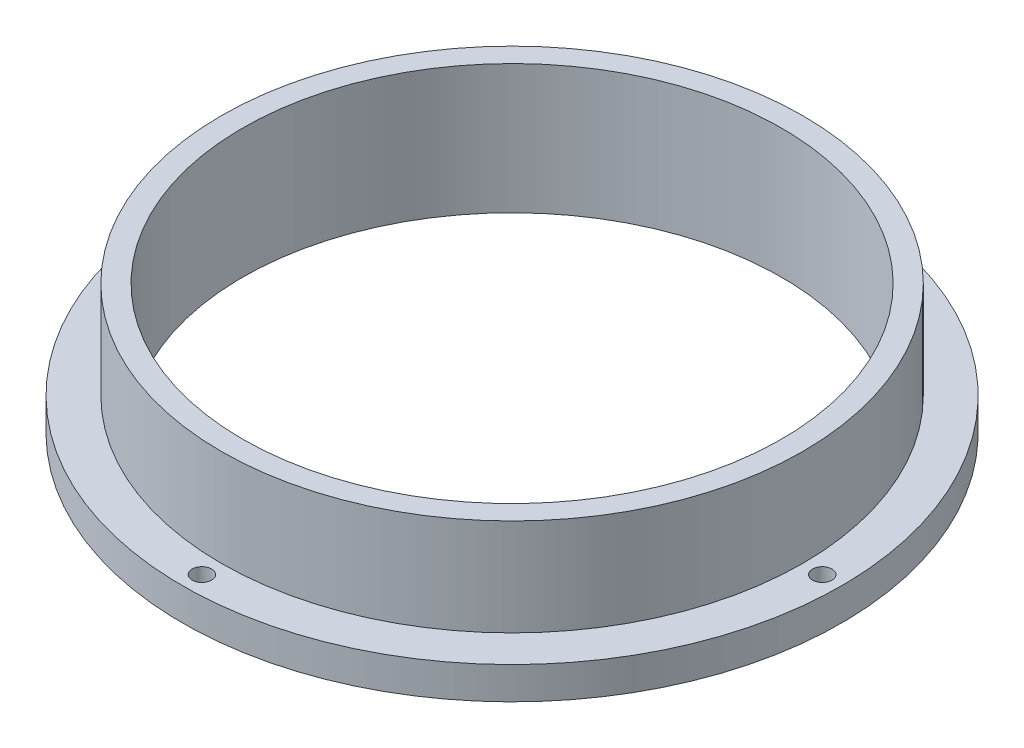
ISO-10303-21;
HEADER;
FILE_DESCRIPTION(('STEP AP214'),'2;1');
FILE_NAME('part.step','',(''),(''),'','','');
FILE_SCHEMA(('AUTOMOTIVE_DESIGN { 1 0 10303 214 1 1 1 1 }'));
ENDSEC;
DATA;
#1=APPLICATION_CONTEXT('core data for automotive mechanical design processes');
#2=APPLICATION_PROTOCOL_DEFINITION('international standard','automotive_design',2000,#1);
#3=PRODUCT_CONTEXT('',#1,'mechanical');
#4=PRODUCT('Part','Part','',(#3));
#5=PRODUCT_RELATED_PRODUCT_CATEGORY('part','',(#4));
#6=PRODUCT_DEFINITION_FORMATION('','',#4);
#7=PRODUCT_DEFINITION_CONTEXT('part definition',#1,'design');
#8=PRODUCT_DEFINITION('design','',#6,#7);
#9=PRODUCT_DEFINITION_SHAPE('','',#8);
#10=(LENGTH_UNIT() NAMED_UNIT(*) SI_UNIT(.MILLI.,.METRE.));
#11=(NAMED_UNIT(*) PLANE_ANGLE_UNIT() SI_UNIT($,.RADIAN.));
#12=(NAMED_UNIT(*) SI_UNIT($,.STERADIAN.) SOLID_ANGLE_UNIT());
#13=UNCERTAINTY_MEASURE_WITH_UNIT(LENGTH_MEASURE(1.E-05),#10,'distance_accuracy_value','');
#14=(GEOMETRIC_REPRESENTATION_CONTEXT(3) GLOBAL_UNCERTAINTY_ASSIGNED_CONTEXT((#13)) GLOBAL_UNIT_ASSIGNED_CONTEXT((#10,
#11,#12)) REPRESENTATION_CONTEXT('',''));
#15=CARTESIAN_POINT('',(0.,0.,0.));
#16=DIRECTION('',(0.,0.,1.));
#17=DIRECTION('',(1.,0.,0.));
#18=AXIS2_PLACEMENT_3D('',#15,#16,#17);
#19=CARTESIAN_POINT('',(0.,20.,0.));
#20=DIRECTION('',(0.,-1.,0.));
#21=DIRECTION('',(0.,0.,-1.));
#22=AXIS2_PLACEMENT_3D('',#19,#20,#21);
#23=CYLINDRICAL_SURFACE('',#22,45.);
#24=CARTESIAN_POINT('',(0.,20.,0.));
#25=DIRECTION('',(0.,1.,0.));
#26=DIRECTION('',(0.,0.,1.));
#27=AXIS2_PLACEMENT_3D('',#24,#25,#26);
#28=CIRCLE('',#27,45.);
#29=CARTESIAN_POINT('',(0.,20.,45.));
#30=VERTEX_POINT('',#29);
#31=EDGE_CURVE('E49',#30,#30,#28,.T.);
#32=ORIENTED_EDGE('',*,*,#31,.F.);
#33=EDGE_LOOP('',(#32));
#34=FACE_BOUND('',#33,.T.);
#35=CARTESIAN_POINT('',(0.,5.,0.));
#36=DIRECTION('',(0.,-1.,0.));
#37=DIRECTION('',(0.,0.,-1.));
#38=AXIS2_PLACEMENT_3D('',#35,#36,#37);
#39=CIRCLE('',#38,45.);
#40=CARTESIAN_POINT('',(0.,5.,-45.));
#41=VERTEX_POINT('',#40);
#42=EDGE_CURVE('E10',#41,#41,#39,.T.);
#43=ORIENTED_EDGE('',*,*,#42,.F.);
#44=EDGE_LOOP('',(#43));
#45=FACE_BOUND('',#44,.T.);
#46=ADVANCED_FACE('F42',(#34,#45),#23,.T.);
#47=CARTESIAN_POINT('',(0.,20.,0.));
#48=DIRECTION('',(0.,1.,0.));
#49=DIRECTION('',(0.,0.,1.));
#50=AXIS2_PLACEMENT_3D('',#47,#48,#49);
#51=PLANE('',#50);
#52=CARTESIAN_POINT('',(0.,20.,0.));
#53=DIRECTION('',(0.,1.,0.));
#54=DIRECTION('',(0.,0.,1.));
#55=AXIS2_PLACEMENT_3D('',#52,#53,#54);
#56=CIRCLE('',#55,41.7);
#57=CARTESIAN_POINT('',(0.,20.,41.7));
#58=VERTEX_POINT('',#57);
#59=EDGE_CURVE('E98',#58,#58,#56,.T.);
#60=ORIENTED_EDGE('',*,*,#59,.F.);
#61=EDGE_LOOP('',(#60));
#62=FACE_BOUND('',#61,.T.);
#63=ORIENTED_EDGE('',*,*,#31,.T.);
#64=EDGE_LOOP('',(#63));
#65=FACE_BOUND('',#64,.T.);
#66=ADVANCED_FACE('F116',(#62,#65),#51,.T.);
#67=CARTESIAN_POINT('',(0.,0.,0.));
#68=DIRECTION('',(0.,1.,0.));
#69=DIRECTION('',(0.,0.,1.));
#70=AXIS2_PLACEMENT_3D('',#67,#68,#69);
#71=PLANE('',#70);
#72=CARTESIAN_POINT('',(0.,0.,0.));
#73=DIRECTION('',(0.,1.,0.));
#74=DIRECTION('',(0.,0.,1.));
#75=AXIS2_PLACEMENT_3D('',#72,#73,#74);
#76=CIRCLE('',#75,41.7);
#77=CARTESIAN_POINT('',(0.,0.,41.7));
#78=VERTEX_POINT('',#77);
#79=EDGE_CURVE('E82',#78,#78,#76,.T.);
#80=ORIENTED_EDGE('',*,*,#79,.T.);
#81=EDGE_LOOP('',(#80));
#82=FACE_BOUND('',#81,.T.);
#83=CARTESIAN_POINT('',(48.,0.,0.));
#84=DIRECTION('',(0.,-1.,0.));
#85=DIRECTION('',(0.,0.,-1.));
#86=AXIS2_PLACEMENT_3D('',#83,#84,#85);
#87=CIRCLE('',#86,1.5);
#88=CARTESIAN_POINT('',(48.,0.,-1.5));
#89=VERTEX_POINT('',#88);
#90=EDGE_CURVE('E79',#89,#89,#87,.T.);
#91=ORIENTED_EDGE('',*,*,#90,.F.);
#92=EDGE_LOOP('',(#91));
#93=FACE_BOUND('',#92,.T.);
#94=CARTESIAN_POINT('',(5.02773312793411E-13,0.,48.));
#95=DIRECTION('',(0.,-1.,0.));
#96=DIRECTION('',(0.,0.,-1.));
#97=AXIS2_PLACEMENT_3D('',#94,#95,#96);
#98=CIRCLE('',#97,1.50000000000001);
#99=CARTESIAN_POINT('',(5.02773312793411E-13,0.,46.5));
#100=VERTEX_POINT('',#99);
#101=EDGE_CURVE('E75',#100,#100,#98,.T.);
#102=ORIENTED_EDGE('',*,*,#101,.F.);
#103=EDGE_LOOP('',(#102));
#104=FACE_BOUND('',#103,.T.);
#105=CARTESIAN_POINT('',(-48.,0.,3.35182208528941E-13));
#106=DIRECTION('',(0.,-1.,0.));
#107=DIRECTION('',(0.,0.,-1.));
#108=AXIS2_PLACEMENT_3D('',#105,#106,#107);
#109=CIRCLE('',#108,1.5);
#110=CARTESIAN_POINT('',(-48.,0.,-1.49999999999967));
#111=VERTEX_POINT('',#110);
#112=EDGE_CURVE('E71',#111,#111,#109,.T.);
#113=ORIENTED_EDGE('',*,*,#112,.F.);
#114=EDGE_LOOP('',(#113));
#115=FACE_BOUND('',#114,.T.);
#116=CARTESIAN_POINT('',(-1.6759110426447E-13,0.,-48.));
#117=DIRECTION('',(0.,-1.,0.));
#118=DIRECTION('',(0.,0.,-1.));
#119=AXIS2_PLACEMENT_3D('',#116,#117,#118);
#120=CIRCLE('',#119,1.5);
#121=CARTESIAN_POINT('',(-1.6759110426447E-13,0.,-49.5));
#122=VERTEX_POINT('',#121);
#123=EDGE_CURVE('E67',#122,#122,#120,.T.);
#124=ORIENTED_EDGE('',*,*,#123,.F.);
#125=EDGE_LOOP('',(#124));
#126=FACE_BOUND('',#125,.T.);
#127=CARTESIAN_POINT('',(0.,0.,0.));
#128=DIRECTION('',(0.,-1.,0.));
#129=DIRECTION('',(0.,0.,-1.));
#130=AXIS2_PLACEMENT_3D('',#127,#128,#129);
#131=CIRCLE('',#130,51.);
#132=CARTESIAN_POINT('',(0.,0.,-51.));
#133=VERTEX_POINT('',#132);
#134=EDGE_CURVE('E62',#133,#133,#131,.T.);
#135=ORIENTED_EDGE('',*,*,#134,.T.);
#136=EDGE_LOOP('',(#135));
#137=FACE_BOUND('',#136,.T.);
#138=ADVANCED_FACE('F106',(#82,#93,#104,#115,#126,#137),#71,.F.);
#139=CARTESIAN_POINT('',(-1.6759110426447E-13,5.,-48.));
#140=DIRECTION('',(0.,-1.,0.));
#141=DIRECTION('',(0.,0.,-1.));
#142=AXIS2_PLACEMENT_3D('',#139,#140,#141);
#143=CYLINDRICAL_SURFACE('',#142,1.5);
#144=CARTESIAN_POINT('',(-1.6759110426447E-13,5.,-48.));
#145=DIRECTION('',(0.,-1.,0.));
#146=DIRECTION('',(0.,0.,-1.));
#147=AXIS2_PLACEMENT_3D('',#144,#145,#146);
#148=CIRCLE('',#147,1.5);
#149=CARTESIAN_POINT('',(-1.6759110426447E-13,5.,-49.5));
#150=VERTEX_POINT('',#149);
#151=EDGE_CURVE('E59',#150,#150,#148,.T.);
#152=ORIENTED_EDGE('',*,*,#151,.F.);
#153=EDGE_LOOP('',(#152));
#154=FACE_BOUND('',#153,.T.);
#155=ORIENTED_EDGE('',*,*,#123,.T.);
#156=EDGE_LOOP('',(#155));
#157=FACE_BOUND('',#156,.T.);
#158=ADVANCED_FACE('F123',(#154,#157),#143,.F.);
#159=CARTESIAN_POINT('',(-48.,5.,3.35182208528941E-13));
#160=DIRECTION('',(0.,-1.,0.));
#161=DIRECTION('',(0.,0.,-1.));
#162=AXIS2_PLACEMENT_3D('',#159,#160,#161);
#163=CYLINDRICAL_SURFACE('',#162,1.5);
#164=CARTESIAN_POINT('',(-48.,5.,3.35182208528941E-13));
#165=DIRECTION('',(0.,-1.,0.));
#166=DIRECTION('',(0.,0.,-1.));
#167=AXIS2_PLACEMENT_3D('',#164,#165,#166);
#168=CIRCLE('',#167,1.5);
#169=CARTESIAN_POINT('',(-48.,5.,-1.49999999999967));
#170=VERTEX_POINT('',#169);
#171=EDGE_CURVE('E87',#170,#170,#168,.T.);
#172=ORIENTED_EDGE('',*,*,#171,.F.);
#173=EDGE_LOOP('',(#172));
#174=FACE_BOUND('',#173,.T.);
#175=ORIENTED_EDGE('',*,*,#112,.T.);
#176=EDGE_LOOP('',(#175));
#177=FACE_BOUND('',#176,.T.);
#178=ADVANCED_FACE('F135',(#174,#177),#163,.F.);
#179=CARTESIAN_POINT('',(5.02773312793411E-13,5.,48.));
#180=DIRECTION('',(0.,-1.,0.));
#181=DIRECTION('',(0.,0.,-1.));
#182=AXIS2_PLACEMENT_3D('',#179,#180,#181);
#183=CYLINDRICAL_SURFACE('',#182,1.50000000000001);
#184=CARTESIAN_POINT('',(5.02773312793411E-13,5.,48.));
#185=DIRECTION('',(0.,-1.,0.));
#186=DIRECTION('',(0.,0.,-1.));
#187=AXIS2_PLACEMENT_3D('',#184,#185,#186);
#188=CIRCLE('',#187,1.50000000000001);
#189=CARTESIAN_POINT('',(5.02773312793411E-13,5.,46.5));
#190=VERTEX_POINT('',#189);
#191=EDGE_CURVE('E91',#190,#190,#188,.T.);
#192=ORIENTED_EDGE('',*,*,#191,.F.);
#193=EDGE_LOOP('',(#192));
#194=FACE_BOUND('',#193,.T.);
#195=ORIENTED_EDGE('',*,*,#101,.T.);
#196=EDGE_LOOP('',(#195));
#197=FACE_BOUND('',#196,.T.);
#198=ADVANCED_FACE('F131',(#194,#197),#183,.F.);
#199=CARTESIAN_POINT('',(48.,5.,0.));
#200=DIRECTION('',(0.,-1.,0.));
#201=DIRECTION('',(0.,0.,-1.));
#202=AXIS2_PLACEMENT_3D('',#199,#200,#201);
#203=CYLINDRICAL_SURFACE('',#202,1.5);
#204=CARTESIAN_POINT('',(48.,5.,0.));
#205=DIRECTION('',(0.,-1.,0.));
#206=DIRECTION('',(0.,0.,-1.));
#207=AXIS2_PLACEMENT_3D('',#204,#205,#206);
#208=CIRCLE('',#207,1.5);
#209=CARTESIAN_POINT('',(48.,5.,-1.5));
#210=VERTEX_POINT('',#209);
#211=EDGE_CURVE('E66',#210,#210,#208,.T.);
#212=ORIENTED_EDGE('',*,*,#211,.F.);
#213=EDGE_LOOP('',(#212));
#214=FACE_BOUND('',#213,.T.);
#215=ORIENTED_EDGE('',*,*,#90,.T.);
#216=EDGE_LOOP('',(#215));
#217=FACE_BOUND('',#216,.T.);
#218=ADVANCED_FACE('F127',(#214,#217),#203,.F.);
#219=CARTESIAN_POINT('',(0.,5.,0.));
#220=DIRECTION('',(0.,-1.,0.));
#221=DIRECTION('',(0.,0.,-1.));
#222=AXIS2_PLACEMENT_3D('',#219,#220,#221);
#223=CYLINDRICAL_SURFACE('',#222,51.);
#224=CARTESIAN_POINT('',(0.,5.,0.));
#225=DIRECTION('',(0.,-1.,0.));
#226=DIRECTION('',(0.,0.,-1.));
#227=AXIS2_PLACEMENT_3D('',#224,#225,#226);
#228=CIRCLE('',#227,51.);
#229=CARTESIAN_POINT('',(0.,5.,-51.));
#230=VERTEX_POINT('',#229);
#231=EDGE_CURVE('E54',#230,#230,#228,.T.);
#232=ORIENTED_EDGE('',*,*,#231,.T.);
#233=EDGE_LOOP('',(#232));
#234=FACE_BOUND('',#233,.T.);
#235=ORIENTED_EDGE('',*,*,#134,.F.);
#236=EDGE_LOOP('',(#235));
#237=FACE_BOUND('',#236,.T.);
#238=ADVANCED_FACE('F130',(#234,#237),#223,.T.);
#239=CARTESIAN_POINT('',(0.,5.,0.));
#240=DIRECTION('',(0.,-1.,0.));
#241=DIRECTION('',(0.,0.,-1.));
#242=AXIS2_PLACEMENT_3D('',#239,#240,#241);
#243=PLANE('',#242);
#244=ORIENTED_EDGE('',*,*,#211,.T.);
#245=EDGE_LOOP('',(#244));
#246=FACE_BOUND('',#245,.T.);
#247=ORIENTED_EDGE('',*,*,#191,.T.);
#248=EDGE_LOOP('',(#247));
#249=FACE_BOUND('',#248,.T.);
#250=ORIENTED_EDGE('',*,*,#171,.T.);
#251=EDGE_LOOP('',(#250));
#252=FACE_BOUND('',#251,.T.);
#253=ORIENTED_EDGE('',*,*,#151,.T.);
#254=EDGE_LOOP('',(#253));
#255=FACE_BOUND('',#254,.T.);
#256=ORIENTED_EDGE('',*,*,#42,.T.);
#257=EDGE_LOOP('',(#256));
#258=FACE_BOUND('',#257,.T.);
#259=ORIENTED_EDGE('',*,*,#231,.F.);
#260=EDGE_LOOP('',(#259));
#261=FACE_BOUND('',#260,.T.);
#262=ADVANCED_FACE('F112',(#246,#249,#252,#255,#258,#261),#243,.F.);
#263=CARTESIAN_POINT('',(0.,0.,0.));
#264=DIRECTION('',(0.,1.,0.));
#265=DIRECTION('',(0.,0.,1.));
#266=AXIS2_PLACEMENT_3D('',#263,#264,#265);
#267=CYLINDRICAL_SURFACE('',#266,41.7);
#268=ORIENTED_EDGE('',*,*,#79,.F.);
#269=EDGE_LOOP('',(#268));
#270=FACE_BOUND('',#269,.T.);
#271=ORIENTED_EDGE('',*,*,#59,.T.);
#272=EDGE_LOOP('',(#271));
#273=FACE_BOUND('',#272,.T.);
#274=ADVANCED_FACE('F109',(#270,#273),#267,.F.);
#275=CLOSED_SHELL('',(#46,#66,#138,#158,#178,#198,#218,#238,#262,#274));
#276=MANIFOLD_SOLID_BREP('B2',#275);
#277=ADVANCED_BREP_SHAPE_REPRESENTATION('',(#18,#276),#14);
#278=SHAPE_DEFINITION_REPRESENTATION(#9,#277);
ENDSEC;
END-ISO-10303-21;
